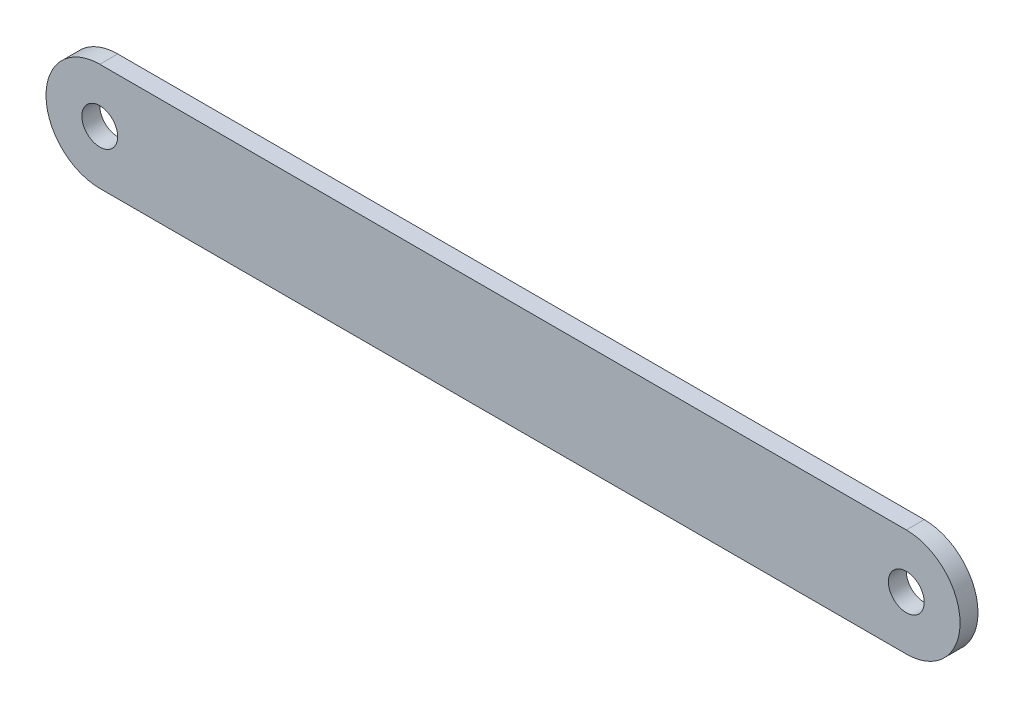
ISO-10303-21;
HEADER;
FILE_DESCRIPTION(('STEP AP214'),'2;1');
FILE_NAME('part.step','',(''),(''),'','','');
FILE_SCHEMA(('AUTOMOTIVE_DESIGN { 1 0 10303 214 1 1 1 1 }'));
ENDSEC;
DATA;
#1=APPLICATION_CONTEXT('core data for automotive mechanical design processes');
#2=APPLICATION_PROTOCOL_DEFINITION('international standard','automotive_design',2000,#1);
#3=PRODUCT_CONTEXT('',#1,'mechanical');
#4=PRODUCT('Part','Part','',(#3));
#5=PRODUCT_RELATED_PRODUCT_CATEGORY('part','',(#4));
#6=PRODUCT_DEFINITION_FORMATION('','',#4);
#7=PRODUCT_DEFINITION_CONTEXT('part definition',#1,'design');
#8=PRODUCT_DEFINITION('design','',#6,#7);
#9=PRODUCT_DEFINITION_SHAPE('','',#8);
#10=(LENGTH_UNIT() NAMED_UNIT(*) SI_UNIT(.MILLI.,.METRE.));
#11=(NAMED_UNIT(*) PLANE_ANGLE_UNIT() SI_UNIT($,.RADIAN.));
#12=(NAMED_UNIT(*) SI_UNIT($,.STERADIAN.) SOLID_ANGLE_UNIT());
#13=UNCERTAINTY_MEASURE_WITH_UNIT(LENGTH_MEASURE(1.E-05),#10,'distance_accuracy_value','');
#14=(GEOMETRIC_REPRESENTATION_CONTEXT(3) GLOBAL_UNCERTAINTY_ASSIGNED_CONTEXT((#13)) GLOBAL_UNIT_ASSIGNED_CONTEXT((#10,
#11,#12)) REPRESENTATION_CONTEXT('',''));
#15=CARTESIAN_POINT('',(0.,0.,0.));
#16=DIRECTION('',(0.,0.,1.));
#17=DIRECTION('',(1.,0.,0.));
#18=AXIS2_PLACEMENT_3D('',#15,#16,#17);
#19=CARTESIAN_POINT('',(-450.,0.,20.));
#20=DIRECTION('',(0.,0.,1.));
#21=DIRECTION('',(1.,0.,0.));
#22=AXIS2_PLACEMENT_3D('',#19,#20,#21);
#23=PLANE('',#22);
#24=CARTESIAN_POINT('',(450.,0.,20.));
#25=DIRECTION('',(0.,0.,1.));
#26=DIRECTION('',(1.,0.,0.));
#27=AXIS2_PLACEMENT_3D('',#24,#25,#26);
#28=CIRCLE('',#27,20.);
#29=CARTESIAN_POINT('',(470.,0.,20.));
#30=VERTEX_POINT('',#29);
#31=EDGE_CURVE('E112',#30,#30,#28,.T.);
#32=ORIENTED_EDGE('',*,*,#31,.F.);
#33=EDGE_LOOP('',(#32));
#34=FACE_BOUND('',#33,.T.);
#35=CARTESIAN_POINT('',(-450.,0.,20.));
#36=DIRECTION('',(0.,0.,1.));
#37=DIRECTION('',(1.,0.,0.));
#38=AXIS2_PLACEMENT_3D('',#35,#36,#37);
#39=CIRCLE('',#38,60.);
#40=CARTESIAN_POINT('',(-450.,60.,20.));
#41=VERTEX_POINT('',#40);
#42=CARTESIAN_POINT('',(-450.,-60.,20.));
#43=VERTEX_POINT('',#42);
#44=EDGE_CURVE('E92',#41,#43,#39,.T.);
#45=ORIENTED_EDGE('',*,*,#44,.T.);
#46=DIRECTION('',(1.,0.,0.));
#47=VECTOR('',#46,1.);
#48=CARTESIAN_POINT('',(-450.,-60.,20.));
#49=LINE('',#48,#47);
#50=CARTESIAN_POINT('',(450.,-60.,20.));
#51=VERTEX_POINT('',#50);
#52=EDGE_CURVE('E87',#43,#51,#49,.T.);
#53=ORIENTED_EDGE('',*,*,#52,.T.);
#54=CARTESIAN_POINT('',(450.,0.,20.));
#55=DIRECTION('',(0.,0.,1.));
#56=DIRECTION('',(1.,0.,0.));
#57=AXIS2_PLACEMENT_3D('',#54,#55,#56);
#58=CIRCLE('',#57,60.);
#59=CARTESIAN_POINT('',(450.,60.,20.));
#60=VERTEX_POINT('',#59);
#61=EDGE_CURVE('E90',#51,#60,#58,.T.);
#62=ORIENTED_EDGE('',*,*,#61,.T.);
#63=DIRECTION('',(-1.,0.,0.));
#64=VECTOR('',#63,1.);
#65=CARTESIAN_POINT('',(-450.,60.,20.));
#66=LINE('',#65,#64);
#67=EDGE_CURVE('E57',#60,#41,#66,.T.);
#68=ORIENTED_EDGE('',*,*,#67,.T.);
#69=EDGE_LOOP('',(#45,#53,#62,#68));
#70=FACE_BOUND('',#69,.T.);
#71=CARTESIAN_POINT('',(-450.,0.,20.));
#72=DIRECTION('',(0.,0.,1.));
#73=DIRECTION('',(1.,0.,0.));
#74=AXIS2_PLACEMENT_3D('',#71,#72,#73);
#75=CIRCLE('',#74,20.);
#76=CARTESIAN_POINT('',(-430.,0.,20.));
#77=VERTEX_POINT('',#76);
#78=EDGE_CURVE('E134',#77,#77,#75,.T.);
#79=ORIENTED_EDGE('',*,*,#78,.F.);
#80=EDGE_LOOP('',(#79));
#81=FACE_BOUND('',#80,.T.);
#82=ADVANCED_FACE('F39',(#34,#70,#81),#23,.T.);
#83=CARTESIAN_POINT('',(-450.,0.,0.));
#84=DIRECTION('',(0.,0.,1.));
#85=DIRECTION('',(1.,0.,0.));
#86=AXIS2_PLACEMENT_3D('',#83,#84,#85);
#87=PLANE('',#86);
#88=CARTESIAN_POINT('',(-450.,0.,0.));
#89=DIRECTION('',(0.,0.,1.));
#90=DIRECTION('',(1.,0.,0.));
#91=AXIS2_PLACEMENT_3D('',#88,#89,#90);
#92=CIRCLE('',#91,60.);
#93=CARTESIAN_POINT('',(-450.,60.,0.));
#94=VERTEX_POINT('',#93);
#95=CARTESIAN_POINT('',(-450.,-60.,0.));
#96=VERTEX_POINT('',#95);
#97=EDGE_CURVE('E108',#94,#96,#92,.T.);
#98=ORIENTED_EDGE('',*,*,#97,.F.);
#99=DIRECTION('',(-1.,0.,0.));
#100=VECTOR('',#99,1.);
#101=CARTESIAN_POINT('',(-450.,60.,0.));
#102=LINE('',#101,#100);
#103=CARTESIAN_POINT('',(450.,60.,0.));
#104=VERTEX_POINT('',#103);
#105=EDGE_CURVE('E80',#104,#94,#102,.T.);
#106=ORIENTED_EDGE('',*,*,#105,.F.);
#107=CARTESIAN_POINT('',(450.,0.,0.));
#108=DIRECTION('',(0.,0.,1.));
#109=DIRECTION('',(1.,0.,0.));
#110=AXIS2_PLACEMENT_3D('',#107,#108,#109);
#111=CIRCLE('',#110,60.);
#112=CARTESIAN_POINT('',(450.,-60.,0.));
#113=VERTEX_POINT('',#112);
#114=EDGE_CURVE('E74',#113,#104,#111,.T.);
#115=ORIENTED_EDGE('',*,*,#114,.F.);
#116=DIRECTION('',(1.,0.,0.));
#117=VECTOR('',#116,1.);
#118=CARTESIAN_POINT('',(-450.,-60.,0.));
#119=LINE('',#118,#117);
#120=EDGE_CURVE('E97',#96,#113,#119,.T.);
#121=ORIENTED_EDGE('',*,*,#120,.F.);
#122=EDGE_LOOP('',(#98,#106,#115,#121));
#123=FACE_BOUND('',#122,.T.);
#124=CARTESIAN_POINT('',(450.,0.,0.));
#125=DIRECTION('',(0.,0.,1.));
#126=DIRECTION('',(1.,0.,0.));
#127=AXIS2_PLACEMENT_3D('',#124,#125,#126);
#128=CIRCLE('',#127,20.);
#129=CARTESIAN_POINT('',(470.,0.,0.));
#130=VERTEX_POINT('',#129);
#131=EDGE_CURVE('E130',#130,#130,#128,.T.);
#132=ORIENTED_EDGE('',*,*,#131,.T.);
#133=EDGE_LOOP('',(#132));
#134=FACE_BOUND('',#133,.T.);
#135=CARTESIAN_POINT('',(-450.,0.,0.));
#136=DIRECTION('',(0.,0.,1.));
#137=DIRECTION('',(1.,0.,0.));
#138=AXIS2_PLACEMENT_3D('',#135,#136,#137);
#139=CIRCLE('',#138,20.);
#140=CARTESIAN_POINT('',(-430.,0.,0.));
#141=VERTEX_POINT('',#140);
#142=EDGE_CURVE('E138',#141,#141,#139,.T.);
#143=ORIENTED_EDGE('',*,*,#142,.T.);
#144=EDGE_LOOP('',(#143));
#145=FACE_BOUND('',#144,.T.);
#146=ADVANCED_FACE('F125',(#123,#134,#145),#87,.F.);
#147=CARTESIAN_POINT('',(-450.,0.,20.));
#148=DIRECTION('',(0.,0.,-1.));
#149=DIRECTION('',(-1.,0.,0.));
#150=AXIS2_PLACEMENT_3D('',#147,#148,#149);
#151=CYLINDRICAL_SURFACE('',#150,60.);
#152=ORIENTED_EDGE('',*,*,#97,.T.);
#153=DIRECTION('',(0.,0.,-1.));
#154=VECTOR('',#153,1.);
#155=CARTESIAN_POINT('',(-450.,-60.,20.));
#156=LINE('',#155,#154);
#157=EDGE_CURVE('E11',#43,#96,#156,.T.);
#158=ORIENTED_EDGE('',*,*,#157,.F.);
#159=ORIENTED_EDGE('',*,*,#44,.F.);
#160=DIRECTION('',(0.,0.,-1.));
#161=VECTOR('',#160,1.);
#162=CARTESIAN_POINT('',(-450.,60.,20.));
#163=LINE('',#162,#161);
#164=EDGE_CURVE('E104',#41,#94,#163,.T.);
#165=ORIENTED_EDGE('',*,*,#164,.T.);
#166=EDGE_LOOP('',(#152,#158,#159,#165));
#167=FACE_BOUND('',#166,.T.);
#168=ADVANCED_FACE('F41',(#167),#151,.T.);
#169=CARTESIAN_POINT('',(-450.,-60.,20.));
#170=DIRECTION('',(0.,1.,0.));
#171=DIRECTION('',(0.,0.,1.));
#172=AXIS2_PLACEMENT_3D('',#169,#170,#171);
#173=PLANE('',#172);
#174=ORIENTED_EDGE('',*,*,#120,.T.);
#175=DIRECTION('',(0.,0.,-1.));
#176=VECTOR('',#175,1.);
#177=CARTESIAN_POINT('',(450.,-60.,20.));
#178=LINE('',#177,#176);
#179=EDGE_CURVE('E49',#51,#113,#178,.T.);
#180=ORIENTED_EDGE('',*,*,#179,.F.);
#181=ORIENTED_EDGE('',*,*,#52,.F.);
#182=ORIENTED_EDGE('',*,*,#157,.T.);
#183=EDGE_LOOP('',(#174,#180,#181,#182));
#184=FACE_BOUND('',#183,.T.);
#185=ADVANCED_FACE('F96',(#184),#173,.F.);
#186=CARTESIAN_POINT('',(450.,0.,20.));
#187=DIRECTION('',(0.,0.,-1.));
#188=DIRECTION('',(-1.,0.,0.));
#189=AXIS2_PLACEMENT_3D('',#186,#187,#188);
#190=CYLINDRICAL_SURFACE('',#189,60.);
#191=ORIENTED_EDGE('',*,*,#114,.T.);
#192=DIRECTION('',(0.,0.,-1.));
#193=VECTOR('',#192,1.);
#194=CARTESIAN_POINT('',(450.,60.,20.));
#195=LINE('',#194,#193);
#196=EDGE_CURVE('E99',#60,#104,#195,.T.);
#197=ORIENTED_EDGE('',*,*,#196,.F.);
#198=ORIENTED_EDGE('',*,*,#61,.F.);
#199=ORIENTED_EDGE('',*,*,#179,.T.);
#200=EDGE_LOOP('',(#191,#197,#198,#199));
#201=FACE_BOUND('',#200,.T.);
#202=ADVANCED_FACE('F100',(#201),#190,.T.);
#203=CARTESIAN_POINT('',(-450.,60.,20.));
#204=DIRECTION('',(0.,-1.,0.));
#205=DIRECTION('',(0.,0.,-1.));
#206=AXIS2_PLACEMENT_3D('',#203,#204,#205);
#207=PLANE('',#206);
#208=ORIENTED_EDGE('',*,*,#105,.T.);
#209=ORIENTED_EDGE('',*,*,#164,.F.);
#210=ORIENTED_EDGE('',*,*,#67,.F.);
#211=ORIENTED_EDGE('',*,*,#196,.T.);
#212=EDGE_LOOP('',(#208,#209,#210,#211));
#213=FACE_BOUND('',#212,.T.);
#214=ADVANCED_FACE('F122',(#213),#207,.F.);
#215=CARTESIAN_POINT('',(450.,0.,20.));
#216=DIRECTION('',(0.,0.,-1.));
#217=DIRECTION('',(-1.,0.,0.));
#218=AXIS2_PLACEMENT_3D('',#215,#216,#217);
#219=CYLINDRICAL_SURFACE('',#218,20.);
#220=ORIENTED_EDGE('',*,*,#31,.T.);
#221=EDGE_LOOP('',(#220));
#222=FACE_BOUND('',#221,.T.);
#223=ORIENTED_EDGE('',*,*,#131,.F.);
#224=EDGE_LOOP('',(#223));
#225=FACE_BOUND('',#224,.T.);
#226=ADVANCED_FACE('F157',(#222,#225),#219,.F.);
#227=CARTESIAN_POINT('',(-450.,0.,20.));
#228=DIRECTION('',(0.,0.,-1.));
#229=DIRECTION('',(-1.,0.,0.));
#230=AXIS2_PLACEMENT_3D('',#227,#228,#229);
#231=CYLINDRICAL_SURFACE('',#230,20.);
#232=ORIENTED_EDGE('',*,*,#78,.T.);
#233=EDGE_LOOP('',(#232));
#234=FACE_BOUND('',#233,.T.);
#235=ORIENTED_EDGE('',*,*,#142,.F.);
#236=EDGE_LOOP('',(#235));
#237=FACE_BOUND('',#236,.T.);
#238=ADVANCED_FACE('F146',(#234,#237),#231,.F.);
#239=CLOSED_SHELL('',(#82,#146,#168,#185,#202,#214,#226,#238));
#240=MANIFOLD_SOLID_BREP('B2',#239);
#241=ADVANCED_BREP_SHAPE_REPRESENTATION('',(#18,#240),#14);
#242=SHAPE_DEFINITION_REPRESENTATION(#9,#241);
ENDSEC;
END-ISO-10303-21;
